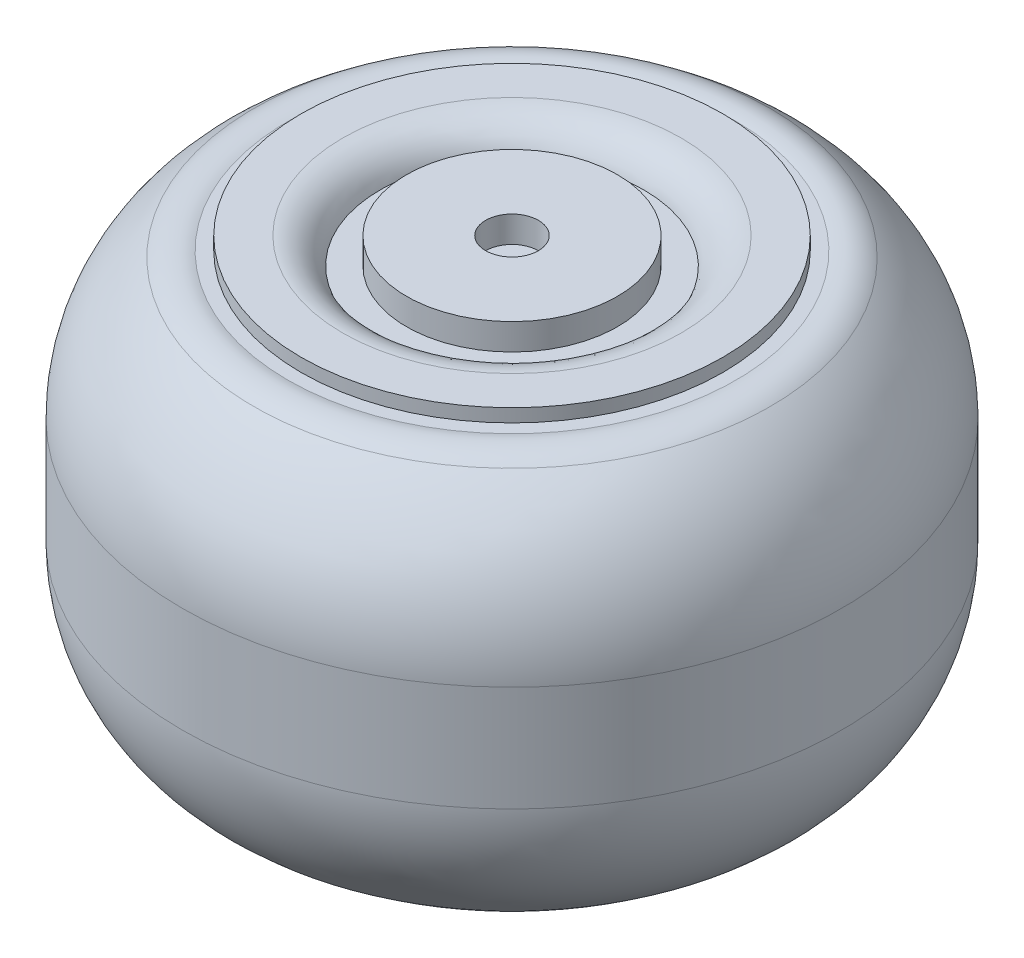
ISO-10303-21;
HEADER;
FILE_DESCRIPTION(('STEP AP214'),'2;1');
FILE_NAME('part.step','',(''),(''),'','','');
FILE_SCHEMA(('AUTOMOTIVE_DESIGN { 1 0 10303 214 1 1 1 1 }'));
ENDSEC;
DATA;
#1=APPLICATION_CONTEXT('core data for automotive mechanical design processes');
#2=APPLICATION_PROTOCOL_DEFINITION('international standard','automotive_design',2000,#1);
#3=PRODUCT_CONTEXT('',#1,'mechanical');
#4=PRODUCT('Part','Part','',(#3));
#5=PRODUCT_RELATED_PRODUCT_CATEGORY('part','',(#4));
#6=PRODUCT_DEFINITION_FORMATION('','',#4);
#7=PRODUCT_DEFINITION_CONTEXT('part definition',#1,'design');
#8=PRODUCT_DEFINITION('design','',#6,#7);
#9=PRODUCT_DEFINITION_SHAPE('','',#8);
#10=(LENGTH_UNIT() NAMED_UNIT(*) SI_UNIT(.MILLI.,.METRE.));
#11=(NAMED_UNIT(*) PLANE_ANGLE_UNIT() SI_UNIT($,.RADIAN.));
#12=(NAMED_UNIT(*) SI_UNIT($,.STERADIAN.) SOLID_ANGLE_UNIT());
#13=UNCERTAINTY_MEASURE_WITH_UNIT(LENGTH_MEASURE(1.E-05),#10,'distance_accuracy_value','');
#14=(GEOMETRIC_REPRESENTATION_CONTEXT(3) GLOBAL_UNCERTAINTY_ASSIGNED_CONTEXT((#13)) GLOBAL_UNIT_ASSIGNED_CONTEXT((#10,
#11,#12)) REPRESENTATION_CONTEXT('',''));
#15=CARTESIAN_POINT('',(0.,0.,0.));
#16=DIRECTION('',(0.,0.,1.));
#17=DIRECTION('',(1.,0.,0.));
#18=AXIS2_PLACEMENT_3D('',#15,#16,#17);
#19=CARTESIAN_POINT('',(0.,2.,-25.));
#20=DIRECTION('',(0.,-1.,0.));
#21=DIRECTION('',(0.,0.,-1.));
#22=AXIS2_PLACEMENT_3D('',#19,#20,#21);
#23=CYLINDRICAL_SURFACE('',#22,17.);
#24=CARTESIAN_POINT('',(0.,1.,-25.));
#25=DIRECTION('',(0.,-1.,0.));
#26=DIRECTION('',(0.,0.,-1.));
#27=AXIS2_PLACEMENT_3D('',#24,#25,#26);
#28=CIRCLE('',#27,17.);
#29=CARTESIAN_POINT('',(0.,1.,-42.));
#30=VERTEX_POINT('',#29);
#31=EDGE_CURVE('E57',#30,#30,#28,.T.);
#32=ORIENTED_EDGE('',*,*,#31,.F.);
#33=EDGE_LOOP('',(#32));
#34=FACE_BOUND('',#33,.T.);
#35=CARTESIAN_POINT('',(0.,0.,-25.));
#36=DIRECTION('',(0.,-1.,0.));
#37=DIRECTION('',(0.,0.,-1.));
#38=AXIS2_PLACEMENT_3D('',#35,#36,#37);
#39=CIRCLE('',#38,17.);
#40=CARTESIAN_POINT('',(0.,0.,-42.));
#41=VERTEX_POINT('',#40);
#42=EDGE_CURVE('E54',#41,#41,#39,.T.);
#43=ORIENTED_EDGE('',*,*,#42,.T.);
#44=EDGE_LOOP('',(#43));
#45=FACE_BOUND('',#44,.T.);
#46=ADVANCED_FACE('F34',(#34,#45),#23,.F.);
#47=CARTESIAN_POINT('',(0.,1.,-8.));
#48=DIRECTION('',(0.,1.,0.));
#49=DIRECTION('',(0.,0.,1.));
#50=AXIS2_PLACEMENT_3D('',#47,#48,#49);
#51=PLANE('',#50);
#52=CARTESIAN_POINT('',(0.,1.,-25.));
#53=DIRECTION('',(0.,-1.,0.));
#54=DIRECTION('',(0.,0.,-1.));
#55=AXIS2_PLACEMENT_3D('',#52,#53,#54);
#56=CIRCLE('',#55,16.);
#57=CARTESIAN_POINT('',(0.,1.,-41.));
#58=VERTEX_POINT('',#57);
#59=EDGE_CURVE('E60',#58,#58,#56,.T.);
#60=ORIENTED_EDGE('',*,*,#59,.F.);
#61=EDGE_LOOP('',(#60));
#62=FACE_BOUND('',#61,.T.);
#63=ORIENTED_EDGE('',*,*,#31,.T.);
#64=EDGE_LOOP('',(#63));
#65=FACE_BOUND('',#64,.T.);
#66=ADVANCED_FACE('F135',(#62,#65),#51,.F.);
#67=CARTESIAN_POINT('',(0.,2.,-25.));
#68=DIRECTION('',(0.,-1.,0.));
#69=DIRECTION('',(0.,0.,-1.));
#70=AXIS2_PLACEMENT_3D('',#67,#68,#69);
#71=CYLINDRICAL_SURFACE('',#70,16.);
#72=CARTESIAN_POINT('',(0.,0.,-25.));
#73=DIRECTION('',(0.,-1.,0.));
#74=DIRECTION('',(0.,0.,-1.));
#75=AXIS2_PLACEMENT_3D('',#72,#73,#74);
#76=CIRCLE('',#75,16.);
#77=CARTESIAN_POINT('',(0.,0.,-41.));
#78=VERTEX_POINT('',#77);
#79=EDGE_CURVE('E63',#78,#78,#76,.T.);
#80=ORIENTED_EDGE('',*,*,#79,.F.);
#81=EDGE_LOOP('',(#80));
#82=FACE_BOUND('',#81,.T.);
#83=ORIENTED_EDGE('',*,*,#59,.T.);
#84=EDGE_LOOP('',(#83));
#85=FACE_BOUND('',#84,.T.);
#86=ADVANCED_FACE('F141',(#82,#85),#71,.T.);
#87=CARTESIAN_POINT('',(0.,0.,-9.));
#88=DIRECTION('',(0.,1.,0.));
#89=DIRECTION('',(0.,0.,1.));
#90=AXIS2_PLACEMENT_3D('',#87,#88,#89);
#91=PLANE('',#90);
#92=CARTESIAN_POINT('',(0.,0.,-25.));
#93=DIRECTION('',(0.,-1.,0.));
#94=DIRECTION('',(0.,0.,-1.));
#95=AXIS2_PLACEMENT_3D('',#92,#93,#94);
#96=CIRCLE('',#95,10.);
#97=CARTESIAN_POINT('',(0.,0.,-35.));
#98=VERTEX_POINT('',#97);
#99=EDGE_CURVE('E66',#98,#98,#96,.T.);
#100=ORIENTED_EDGE('',*,*,#99,.F.);
#101=EDGE_LOOP('',(#100));
#102=FACE_BOUND('',#101,.T.);
#103=ORIENTED_EDGE('',*,*,#79,.T.);
#104=EDGE_LOOP('',(#103));
#105=FACE_BOUND('',#104,.T.);
#106=ADVANCED_FACE('F211',(#102,#105),#91,.F.);
#107=CARTESIAN_POINT('',(0.,2.,-25.));
#108=DIRECTION('',(0.,-1.,0.));
#109=DIRECTION('',(0.,0.,-1.));
#110=AXIS2_PLACEMENT_3D('',#107,#108,#109);
#111=CYLINDRICAL_SURFACE('',#110,10.);
#112=CARTESIAN_POINT('',(0.,2.,-25.));
#113=DIRECTION('',(0.,-1.,0.));
#114=DIRECTION('',(0.,0.,-1.));
#115=AXIS2_PLACEMENT_3D('',#112,#113,#114);
#116=CIRCLE('',#115,10.);
#117=CARTESIAN_POINT('',(0.,2.,-35.));
#118=VERTEX_POINT('',#117);
#119=EDGE_CURVE('E69',#118,#118,#116,.T.);
#120=ORIENTED_EDGE('',*,*,#119,.F.);
#121=EDGE_LOOP('',(#120));
#122=FACE_BOUND('',#121,.T.);
#123=ORIENTED_EDGE('',*,*,#99,.T.);
#124=EDGE_LOOP('',(#123));
#125=FACE_BOUND('',#124,.T.);
#126=ADVANCED_FACE('F207',(#122,#125),#111,.F.);
#127=CARTESIAN_POINT('',(0.,2.,-15.));
#128=DIRECTION('',(0.,1.,0.));
#129=DIRECTION('',(0.,0.,1.));
#130=AXIS2_PLACEMENT_3D('',#127,#128,#129);
#131=PLANE('',#130);
#132=CARTESIAN_POINT('',(0.,2.,-25.));
#133=DIRECTION('',(0.,-1.,0.));
#134=DIRECTION('',(0.,0.,-1.));
#135=AXIS2_PLACEMENT_3D('',#132,#133,#134);
#136=CIRCLE('',#135,8.);
#137=CARTESIAN_POINT('',(0.,2.,-33.));
#138=VERTEX_POINT('',#137);
#139=EDGE_CURVE('E72',#138,#138,#136,.T.);
#140=ORIENTED_EDGE('',*,*,#139,.F.);
#141=EDGE_LOOP('',(#140));
#142=FACE_BOUND('',#141,.T.);
#143=ORIENTED_EDGE('',*,*,#119,.T.);
#144=EDGE_LOOP('',(#143));
#145=FACE_BOUND('',#144,.T.);
#146=ADVANCED_FACE('F203',(#142,#145),#131,.F.);
#147=CARTESIAN_POINT('',(0.,2.,-25.));
#148=DIRECTION('',(0.,-1.,0.));
#149=DIRECTION('',(0.,0.,-1.));
#150=AXIS2_PLACEMENT_3D('',#147,#148,#149);
#151=CYLINDRICAL_SURFACE('',#150,8.);
#152=CARTESIAN_POINT('',(0.,0.,-25.));
#153=DIRECTION('',(0.,-1.,0.));
#154=DIRECTION('',(0.,0.,-1.));
#155=AXIS2_PLACEMENT_3D('',#152,#153,#154);
#156=CIRCLE('',#155,8.);
#157=CARTESIAN_POINT('',(0.,0.,-33.));
#158=VERTEX_POINT('',#157);
#159=EDGE_CURVE('E75',#158,#158,#156,.T.);
#160=ORIENTED_EDGE('',*,*,#159,.F.);
#161=EDGE_LOOP('',(#160));
#162=FACE_BOUND('',#161,.T.);
#163=ORIENTED_EDGE('',*,*,#139,.T.);
#164=EDGE_LOOP('',(#163));
#165=FACE_BOUND('',#164,.T.);
#166=ADVANCED_FACE('F199',(#162,#165),#151,.T.);
#167=CARTESIAN_POINT('',(0.,0.,-17.));
#168=DIRECTION('',(0.,1.,0.));
#169=DIRECTION('',(0.,0.,1.));
#170=AXIS2_PLACEMENT_3D('',#167,#168,#169);
#171=PLANE('',#170);
#172=CARTESIAN_POINT('',(0.,0.,-25.));
#173=DIRECTION('',(0.,-1.,0.));
#174=DIRECTION('',(0.,0.,-1.));
#175=AXIS2_PLACEMENT_3D('',#172,#173,#174);
#176=CIRCLE('',#175,2.);
#177=CARTESIAN_POINT('',(0.,0.,-27.));
#178=VERTEX_POINT('',#177);
#179=EDGE_CURVE('E78',#178,#178,#176,.T.);
#180=ORIENTED_EDGE('',*,*,#179,.F.);
#181=EDGE_LOOP('',(#180));
#182=FACE_BOUND('',#181,.T.);
#183=ORIENTED_EDGE('',*,*,#159,.T.);
#184=EDGE_LOOP('',(#183));
#185=FACE_BOUND('',#184,.T.);
#186=ADVANCED_FACE('F195',(#182,#185),#171,.F.);
#187=CARTESIAN_POINT('',(0.,2.,-25.));
#188=DIRECTION('',(0.,-1.,0.));
#189=DIRECTION('',(0.,0.,-1.));
#190=AXIS2_PLACEMENT_3D('',#187,#188,#189);
#191=CYLINDRICAL_SURFACE('',#190,2.);
#192=CARTESIAN_POINT('',(0.,2.,-25.));
#193=DIRECTION('',(0.,-1.,0.));
#194=DIRECTION('',(0.,0.,-1.));
#195=AXIS2_PLACEMENT_3D('',#192,#193,#194);
#196=CIRCLE('',#195,2.);
#197=CARTESIAN_POINT('',(0.,2.,-27.));
#198=VERTEX_POINT('',#197);
#199=EDGE_CURVE('E81',#198,#198,#196,.T.);
#200=ORIENTED_EDGE('',*,*,#199,.F.);
#201=EDGE_LOOP('',(#200));
#202=FACE_BOUND('',#201,.T.);
#203=ORIENTED_EDGE('',*,*,#179,.T.);
#204=EDGE_LOOP('',(#203));
#205=FACE_BOUND('',#204,.T.);
#206=ADVANCED_FACE('F189',(#202,#205),#191,.F.);
#207=CARTESIAN_POINT('',(0.,2.,-25.));
#208=DIRECTION('',(0.,1.,0.));
#209=DIRECTION('',(0.,0.,1.));
#210=AXIS2_PLACEMENT_3D('',#207,#208,#209);
#211=PLANE('',#210);
#212=ORIENTED_EDGE('',*,*,#199,.T.);
#213=EDGE_LOOP('',(#212));
#214=FACE_BOUND('',#213,.T.);
#215=ADVANCED_FACE('F184',(#214),#211,.F.);
#216=CARTESIAN_POINT('',(0.,30.,-25.));
#217=DIRECTION('',(0.,-1.,0.));
#218=DIRECTION('',(0.,0.,-1.));
#219=AXIS2_PLACEMENT_3D('',#216,#217,#218);
#220=PLANE('',#219);
#221=CARTESIAN_POINT('',(0.,30.,-25.));
#222=DIRECTION('',(0.,-1.,0.));
#223=DIRECTION('',(0.,0.,-1.));
#224=AXIS2_PLACEMENT_3D('',#221,#222,#223);
#225=CIRCLE('',#224,2.);
#226=CARTESIAN_POINT('',(0.,30.,-27.));
#227=VERTEX_POINT('',#226);
#228=EDGE_CURVE('E84',#227,#227,#225,.T.);
#229=ORIENTED_EDGE('',*,*,#228,.F.);
#230=EDGE_LOOP('',(#229));
#231=FACE_BOUND('',#230,.T.);
#232=ADVANCED_FACE('F179',(#231),#220,.F.);
#233=CARTESIAN_POINT('',(0.,2.,-25.));
#234=DIRECTION('',(0.,-1.,0.));
#235=DIRECTION('',(0.,0.,-1.));
#236=AXIS2_PLACEMENT_3D('',#233,#234,#235);
#237=CYLINDRICAL_SURFACE('',#236,2.);
#238=CARTESIAN_POINT('',(0.,32.,-25.));
#239=DIRECTION('',(0.,-1.,0.));
#240=DIRECTION('',(0.,0.,-1.));
#241=AXIS2_PLACEMENT_3D('',#238,#239,#240);
#242=CIRCLE('',#241,2.);
#243=CARTESIAN_POINT('',(0.,32.,-27.));
#244=VERTEX_POINT('',#243);
#245=EDGE_CURVE('E87',#244,#244,#242,.T.);
#246=ORIENTED_EDGE('',*,*,#245,.F.);
#247=EDGE_LOOP('',(#246));
#248=FACE_BOUND('',#247,.T.);
#249=ORIENTED_EDGE('',*,*,#228,.T.);
#250=EDGE_LOOP('',(#249));
#251=FACE_BOUND('',#250,.T.);
#252=ADVANCED_FACE('F173',(#248,#251),#237,.F.);
#253=CARTESIAN_POINT('',(0.,32.,-17.));
#254=DIRECTION('',(0.,-1.,0.));
#255=DIRECTION('',(0.,0.,-1.));
#256=AXIS2_PLACEMENT_3D('',#253,#254,#255);
#257=PLANE('',#256);
#258=CARTESIAN_POINT('',(0.,32.,-25.));
#259=DIRECTION('',(0.,-1.,0.));
#260=DIRECTION('',(0.,0.,-1.));
#261=AXIS2_PLACEMENT_3D('',#258,#259,#260);
#262=CIRCLE('',#261,8.);
#263=CARTESIAN_POINT('',(0.,32.,-33.));
#264=VERTEX_POINT('',#263);
#265=EDGE_CURVE('E90',#264,#264,#262,.T.);
#266=ORIENTED_EDGE('',*,*,#265,.F.);
#267=EDGE_LOOP('',(#266));
#268=FACE_BOUND('',#267,.T.);
#269=ORIENTED_EDGE('',*,*,#245,.T.);
#270=EDGE_LOOP('',(#269));
#271=FACE_BOUND('',#270,.T.);
#272=ADVANCED_FACE('F167',(#268,#271),#257,.F.);
#273=CARTESIAN_POINT('',(0.,2.,-25.));
#274=DIRECTION('',(0.,-1.,0.));
#275=DIRECTION('',(0.,0.,-1.));
#276=AXIS2_PLACEMENT_3D('',#273,#274,#275);
#277=CYLINDRICAL_SURFACE('',#276,8.);
#278=CARTESIAN_POINT('',(0.,30.,-25.));
#279=DIRECTION('',(0.,-1.,0.));
#280=DIRECTION('',(0.,0.,-1.));
#281=AXIS2_PLACEMENT_3D('',#278,#279,#280);
#282=CIRCLE('',#281,8.);
#283=CARTESIAN_POINT('',(0.,30.,-33.));
#284=VERTEX_POINT('',#283);
#285=EDGE_CURVE('E93',#284,#284,#282,.T.);
#286=ORIENTED_EDGE('',*,*,#285,.F.);
#287=EDGE_LOOP('',(#286));
#288=FACE_BOUND('',#287,.T.);
#289=ORIENTED_EDGE('',*,*,#265,.T.);
#290=EDGE_LOOP('',(#289));
#291=FACE_BOUND('',#290,.T.);
#292=ADVANCED_FACE('F131',(#288,#291),#277,.T.);
#293=CARTESIAN_POINT('',(0.,30.,-15.));
#294=DIRECTION('',(0.,-1.,0.));
#295=DIRECTION('',(0.,0.,-1.));
#296=AXIS2_PLACEMENT_3D('',#293,#294,#295);
#297=PLANE('',#296);
#298=CARTESIAN_POINT('',(0.,30.,-25.));
#299=DIRECTION('',(0.,-1.,0.));
#300=DIRECTION('',(0.,0.,-1.));
#301=AXIS2_PLACEMENT_3D('',#298,#299,#300);
#302=CIRCLE('',#301,10.);
#303=CARTESIAN_POINT('',(0.,30.,-35.));
#304=VERTEX_POINT('',#303);
#305=EDGE_CURVE('E96',#304,#304,#302,.T.);
#306=ORIENTED_EDGE('',*,*,#305,.F.);
#307=EDGE_LOOP('',(#306));
#308=FACE_BOUND('',#307,.T.);
#309=ORIENTED_EDGE('',*,*,#285,.T.);
#310=EDGE_LOOP('',(#309));
#311=FACE_BOUND('',#310,.T.);
#312=ADVANCED_FACE('F126',(#308,#311),#297,.F.);
#313=CARTESIAN_POINT('',(0.,32.,-9.));
#314=DIRECTION('',(0.,-1.,0.));
#315=DIRECTION('',(0.,0.,-1.));
#316=AXIS2_PLACEMENT_3D('',#313,#314,#315);
#317=PLANE('',#316);
#318=CARTESIAN_POINT('',(0.,32.,-25.));
#319=DIRECTION('',(0.,-1.,0.));
#320=DIRECTION('',(0.,0.,-1.));
#321=AXIS2_PLACEMENT_3D('',#318,#319,#320);
#322=CIRCLE('',#321,12.8284271247462);
#323=CARTESIAN_POINT('',(0.,32.,-37.8284271247462));
#324=VERTEX_POINT('',#323);
#325=EDGE_CURVE('E41',#324,#324,#322,.T.);
#326=ORIENTED_EDGE('',*,*,#325,.T.);
#327=EDGE_LOOP('',(#326));
#328=FACE_BOUND('',#327,.T.);
#329=CARTESIAN_POINT('',(0.,32.,-25.));
#330=DIRECTION('',(0.,-1.,0.));
#331=DIRECTION('',(0.,0.,-1.));
#332=AXIS2_PLACEMENT_3D('',#329,#330,#331);
#333=CIRCLE('',#332,16.);
#334=CARTESIAN_POINT('',(0.,32.,-41.));
#335=VERTEX_POINT('',#334);
#336=EDGE_CURVE('E99',#335,#335,#333,.T.);
#337=ORIENTED_EDGE('',*,*,#336,.F.);
#338=EDGE_LOOP('',(#337));
#339=FACE_BOUND('',#338,.T.);
#340=ADVANCED_FACE('F121',(#328,#339),#317,.F.);
#341=CARTESIAN_POINT('',(0.,2.,-25.));
#342=DIRECTION('',(0.,-1.,0.));
#343=DIRECTION('',(0.,0.,-1.));
#344=AXIS2_PLACEMENT_3D('',#341,#342,#343);
#345=CYLINDRICAL_SURFACE('',#344,16.);
#346=CARTESIAN_POINT('',(0.,31.,-25.));
#347=DIRECTION('',(0.,-1.,0.));
#348=DIRECTION('',(0.,0.,-1.));
#349=AXIS2_PLACEMENT_3D('',#346,#347,#348);
#350=CIRCLE('',#349,16.);
#351=CARTESIAN_POINT('',(0.,31.,-41.));
#352=VERTEX_POINT('',#351);
#353=EDGE_CURVE('E102',#352,#352,#350,.T.);
#354=ORIENTED_EDGE('',*,*,#353,.F.);
#355=EDGE_LOOP('',(#354));
#356=FACE_BOUND('',#355,.T.);
#357=ORIENTED_EDGE('',*,*,#336,.T.);
#358=EDGE_LOOP('',(#357));
#359=FACE_BOUND('',#358,.T.);
#360=ADVANCED_FACE('F115',(#356,#359),#345,.T.);
#361=CARTESIAN_POINT('',(0.,31.,-8.));
#362=DIRECTION('',(0.,-1.,0.));
#363=DIRECTION('',(0.,0.,-1.));
#364=AXIS2_PLACEMENT_3D('',#361,#362,#363);
#365=PLANE('',#364);
#366=CARTESIAN_POINT('',(0.,31.,-25.));
#367=DIRECTION('',(0.,-1.,0.));
#368=DIRECTION('',(0.,0.,-1.));
#369=AXIS2_PLACEMENT_3D('',#366,#367,#368);
#370=CIRCLE('',#369,17.);
#371=CARTESIAN_POINT('',(0.,31.,-42.));
#372=VERTEX_POINT('',#371);
#373=EDGE_CURVE('E105',#372,#372,#370,.T.);
#374=ORIENTED_EDGE('',*,*,#373,.F.);
#375=EDGE_LOOP('',(#374));
#376=FACE_BOUND('',#375,.T.);
#377=ORIENTED_EDGE('',*,*,#353,.T.);
#378=EDGE_LOOP('',(#377));
#379=FACE_BOUND('',#378,.T.);
#380=ADVANCED_FACE('F111',(#376,#379),#365,.F.);
#381=CARTESIAN_POINT('',(0.,2.,-25.));
#382=DIRECTION('',(0.,-1.,0.));
#383=DIRECTION('',(0.,0.,-1.));
#384=AXIS2_PLACEMENT_3D('',#381,#382,#383);
#385=CYLINDRICAL_SURFACE('',#384,25.);
#386=CARTESIAN_POINT('',(0.,12.,-25.));
#387=DIRECTION('',(0.,-1.,0.));
#388=DIRECTION('',(0.,0.,-1.));
#389=AXIS2_PLACEMENT_3D('',#386,#387,#388);
#390=CIRCLE('',#389,25.);
#391=CARTESIAN_POINT('',(0.,12.,-50.));
#392=VERTEX_POINT('',#391);
#393=EDGE_CURVE('E45',#392,#392,#390,.F.);
#394=ORIENTED_EDGE('',*,*,#393,.T.);
#395=EDGE_LOOP('',(#394));
#396=FACE_BOUND('',#395,.T.);
#397=CARTESIAN_POINT('',(0.,20.,-25.));
#398=DIRECTION('',(0.,1.,0.));
#399=DIRECTION('',(0.,0.,1.));
#400=AXIS2_PLACEMENT_3D('',#397,#398,#399);
#401=CIRCLE('',#400,25.);
#402=CARTESIAN_POINT('',(0.,20.,0.));
#403=VERTEX_POINT('',#402);
#404=EDGE_CURVE('E49',#403,#403,#401,.F.);
#405=ORIENTED_EDGE('',*,*,#404,.T.);
#406=EDGE_LOOP('',(#405));
#407=FACE_BOUND('',#406,.T.);
#408=ADVANCED_FACE('F114',(#396,#407),#385,.T.);
#409=CARTESIAN_POINT('',(0.,12.,-25.));
#410=DIRECTION('',(0.,-1.,0.));
#411=DIRECTION('',(0.,0.,-1.));
#412=AXIS2_PLACEMENT_3D('',#409,#410,#411);
#413=DEGENERATE_TOROIDAL_SURFACE('',#412,12.,13.,.T.);
#414=ORIENTED_EDGE('',*,*,#393,.F.);
#415=EDGE_LOOP('',(#414));
#416=FACE_BOUND('',#415,.T.);
#417=ORIENTED_EDGE('',*,*,#42,.F.);
#418=EDGE_LOOP('',(#417));
#419=FACE_BOUND('',#418,.T.);
#420=ADVANCED_FACE('F148',(#416,#419),#413,.T.);
#421=CARTESIAN_POINT('',(0.,20.,-25.));
#422=DIRECTION('',(0.,1.,0.));
#423=DIRECTION('',(0.,0.,1.));
#424=AXIS2_PLACEMENT_3D('',#421,#422,#423);
#425=DEGENERATE_TOROIDAL_SURFACE('',#424,12.,13.,.T.);
#426=CARTESIAN_POINT('',(0.,30.5550770286161,-25.));
#427=DIRECTION('',(0.,-1.,0.));
#428=DIRECTION('',(0.,0.,-1.));
#429=AXIS2_PLACEMENT_3D('',#426,#427,#428);
#430=CIRCLE('',#429,19.5888305370447);
#431=CARTESIAN_POINT('',(0.,30.5550770286161,-44.5888305370447));
#432=VERTEX_POINT('',#431);
#433=EDGE_CURVE('E10',#432,#432,#430,.T.);
#434=ORIENTED_EDGE('',*,*,#433,.T.);
#435=EDGE_LOOP('',(#434));
#436=FACE_BOUND('',#435,.T.);
#437=ORIENTED_EDGE('',*,*,#404,.F.);
#438=EDGE_LOOP('',(#437));
#439=FACE_BOUND('',#438,.T.);
#440=ADVANCED_FACE('F151',(#436,#439),#425,.T.);
#441=CARTESIAN_POINT('',(0.,29.,-25.));
#442=DIRECTION('',(0.,-1.,0.));
#443=DIRECTION('',(0.,0.,-1.));
#444=AXIS2_PLACEMENT_3D('',#441,#442,#443);
#445=TOROIDAL_SURFACE('',#444,12.8284271247462,3.);
#446=ORIENTED_EDGE('',*,*,#305,.T.);
#447=EDGE_LOOP('',(#446));
#448=FACE_BOUND('',#447,.T.);
#449=ORIENTED_EDGE('',*,*,#325,.F.);
#450=EDGE_LOOP('',(#449));
#451=FACE_BOUND('',#450,.T.);
#452=ADVANCED_FACE('F154',(#448,#451),#445,.T.);
#453=CARTESIAN_POINT('',(0.,28.1192900220123,-25.));
#454=DIRECTION('',(0.,1.,0.));
#455=DIRECTION('',(0.,0.,1.));
#456=AXIS2_PLACEMENT_3D('',#453,#454,#455);
#457=TOROIDAL_SURFACE('',#456,17.8375619515728,3.);
#458=ORIENTED_EDGE('',*,*,#373,.T.);
#459=EDGE_LOOP('',(#458));
#460=FACE_BOUND('',#459,.T.);
#461=ORIENTED_EDGE('',*,*,#433,.F.);
#462=EDGE_LOOP('',(#461));
#463=FACE_BOUND('',#462,.T.);
#464=ADVANCED_FACE('F36',(#460,#463),#457,.T.);
#465=CLOSED_SHELL('',(#46,#66,#86,#106,#126,#146,#166,#186,#206,#215,#232,#252,#272,#292,#312,
#340,#360,#380,#408,#420,#440,#452,#464));
#466=MANIFOLD_SOLID_BREP('B2',#465);
#467=ADVANCED_BREP_SHAPE_REPRESENTATION('',(#18,#466),#14);
#468=SHAPE_DEFINITION_REPRESENTATION(#9,#467);
ENDSEC;
END-ISO-10303-21;
